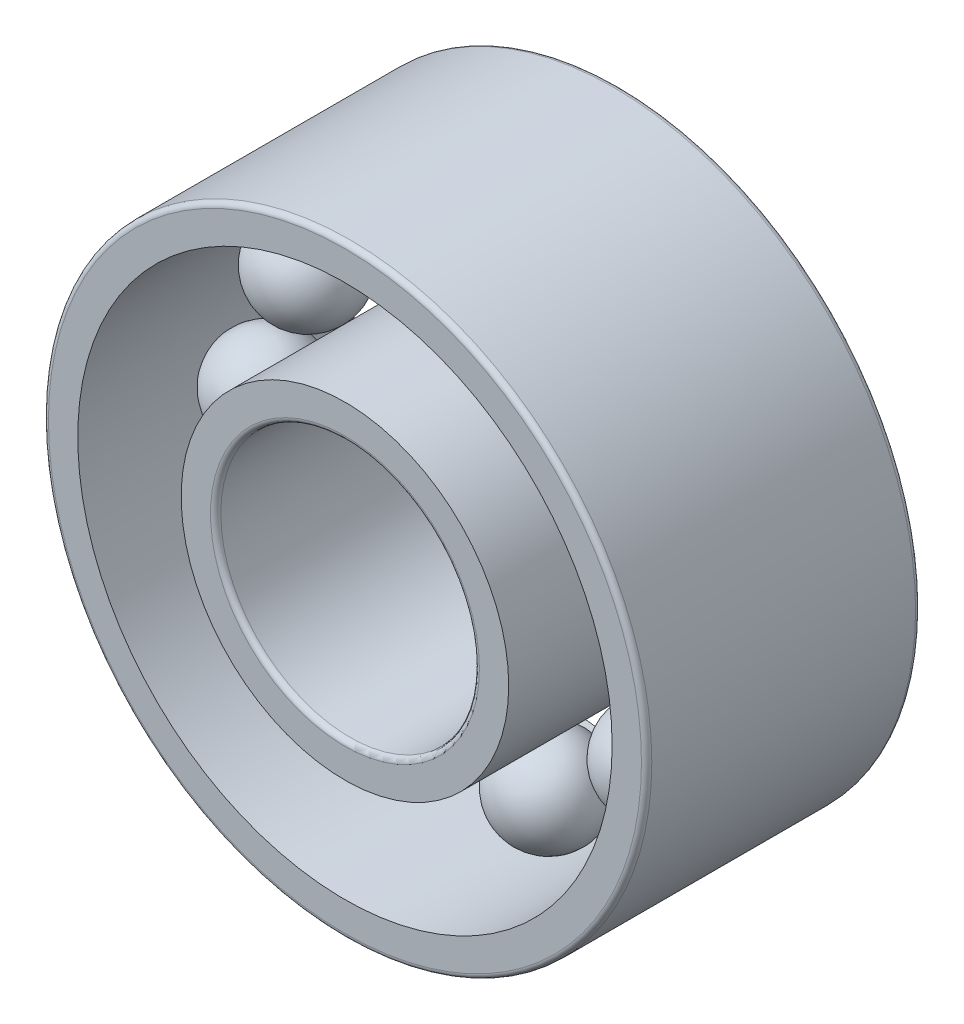
ISO-10303-21;
HEADER;
FILE_DESCRIPTION(('STEP AP214'),'2;1');
FILE_NAME('part.step','',(''),(''),'','','');
FILE_SCHEMA(('AUTOMOTIVE_DESIGN { 1 0 10303 214 1 1 1 1 }'));
ENDSEC;
DATA;
#1=APPLICATION_CONTEXT('core data for automotive mechanical design processes');
#2=APPLICATION_PROTOCOL_DEFINITION('international standard','automotive_design',2000,#1);
#3=PRODUCT_CONTEXT('',#1,'mechanical');
#4=PRODUCT('Part','Part','',(#3));
#5=PRODUCT_RELATED_PRODUCT_CATEGORY('part','',(#4));
#6=PRODUCT_DEFINITION_FORMATION('','',#4);
#7=PRODUCT_DEFINITION_CONTEXT('part definition',#1,'design');
#8=PRODUCT_DEFINITION('design','',#6,#7);
#9=PRODUCT_DEFINITION_SHAPE('','',#8);
#10=(LENGTH_UNIT() NAMED_UNIT(*) SI_UNIT(.MILLI.,.METRE.));
#11=(NAMED_UNIT(*) PLANE_ANGLE_UNIT() SI_UNIT($,.RADIAN.));
#12=(NAMED_UNIT(*) SI_UNIT($,.STERADIAN.) SOLID_ANGLE_UNIT());
#13=UNCERTAINTY_MEASURE_WITH_UNIT(LENGTH_MEASURE(1.E-05),#10,'distance_accuracy_value','');
#14=(GEOMETRIC_REPRESENTATION_CONTEXT(3) GLOBAL_UNCERTAINTY_ASSIGNED_CONTEXT((#13)) GLOBAL_UNIT_ASSIGNED_CONTEXT((#10,
#11,#12)) REPRESENTATION_CONTEXT('',''));
#15=CARTESIAN_POINT('',(0.,0.,0.));
#16=DIRECTION('',(0.,0.,1.));
#17=DIRECTION('',(1.,0.,0.));
#18=AXIS2_PLACEMENT_3D('',#15,#16,#17);
#19=CARTESIAN_POINT('',(10.1127124296868,-7.34731565365592,0.));
#20=DIRECTION('',(-0.809016994374947,0.587785252292473,0.));
#21=DIRECTION('',(0.,0.,-1.));
#22=AXIS2_PLACEMENT_3D('',#19,#20,#21);
#23=SPHERICAL_SURFACE('',#22,2.85);
#24=CARTESIAN_POINT('',(7.80701399571824,-5.67212768462237,0.));
#25=VERTEX_POINT('',#24);
#26=VERTEX_LOOP('',#25);
#27=FACE_BOUND('',#26,.T.);
#28=ADVANCED_FACE('F38',(#27),#23,.T.);
#29=CLOSED_SHELL('',(#28));
#30=MANIFOLD_SOLID_BREP('B2',#29);
#31=CARTESIAN_POINT('',(3.86271242968684,-11.8882064536894,0.));
#32=DIRECTION('',(-0.309016994374947,0.951056516295154,0.));
#33=DIRECTION('',(0.,0.,-1.));
#34=AXIS2_PLACEMENT_3D('',#31,#32,#33);
#35=SPHERICAL_SURFACE('',#34,2.85);
#36=CARTESIAN_POINT('',(2.98201399571824,-9.17769538224823,0.));
#37=VERTEX_POINT('',#36);
#38=VERTEX_LOOP('',#37);
#39=FACE_BOUND('',#38,.T.);
#40=ADVANCED_FACE('F57',(#39),#35,.T.);
#41=CLOSED_SHELL('',(#40));
#42=MANIFOLD_SOLID_BREP('B6',#41);
#43=CARTESIAN_POINT('',(-3.86271242968684,-11.8882064536894,0.));
#44=DIRECTION('',(0.309016994374948,0.951056516295154,0.));
#45=DIRECTION('',(0.,0.,-1.));
#46=AXIS2_PLACEMENT_3D('',#43,#44,#45);
#47=SPHERICAL_SURFACE('',#46,2.85);
#48=CARTESIAN_POINT('',(-2.98201399571824,-9.17769538224823,0.));
#49=VERTEX_POINT('',#48);
#50=VERTEX_LOOP('',#49);
#51=FACE_BOUND('',#50,.T.);
#52=ADVANCED_FACE('F76',(#51),#47,.T.);
#53=CLOSED_SHELL('',(#52));
#54=MANIFOLD_SOLID_BREP('B34',#53);
#55=CARTESIAN_POINT('',(-10.1127124296868,-7.34731565365591,0.));
#56=DIRECTION('',(0.809016994374948,0.587785252292473,0.));
#57=DIRECTION('',(0.,0.,-1.));
#58=AXIS2_PLACEMENT_3D('',#55,#56,#57);
#59=SPHERICAL_SURFACE('',#58,2.85);
#60=CARTESIAN_POINT('',(-7.80701399571825,-5.67212768462237,0.));
#61=VERTEX_POINT('',#60);
#62=VERTEX_LOOP('',#61);
#63=FACE_BOUND('',#62,.T.);
#64=ADVANCED_FACE('F95',(#63),#59,.T.);
#65=CLOSED_SHELL('',(#64));
#66=MANIFOLD_SOLID_BREP('B53',#65);
#67=CARTESIAN_POINT('',(-12.5,0.,0.));
#68=DIRECTION('',(1.,0.,0.));
#69=DIRECTION('',(0.,0.,-1.));
#70=AXIS2_PLACEMENT_3D('',#67,#68,#69);
#71=SPHERICAL_SURFACE('',#70,2.85);
#72=CARTESIAN_POINT('',(-9.65,0.,0.));
#73=VERTEX_POINT('',#72);
#74=VERTEX_LOOP('',#73);
#75=FACE_BOUND('',#74,.T.);
#76=ADVANCED_FACE('F114',(#75),#71,.T.);
#77=CLOSED_SHELL('',(#76));
#78=MANIFOLD_SOLID_BREP('B72',#77);
#79=CARTESIAN_POINT('',(-10.1127124296868,7.34731565365592,0.));
#80=DIRECTION('',(0.809016994374947,-0.587785252292473,0.));
#81=DIRECTION('',(0.,0.,-1.));
#82=AXIS2_PLACEMENT_3D('',#79,#80,#81);
#83=SPHERICAL_SURFACE('',#82,2.85);
#84=CARTESIAN_POINT('',(-7.80701399571824,5.67212768462237,0.));
#85=VERTEX_POINT('',#84);
#86=VERTEX_LOOP('',#85);
#87=FACE_BOUND('',#86,.T.);
#88=ADVANCED_FACE('F133',(#87),#83,.T.);
#89=CLOSED_SHELL('',(#88));
#90=MANIFOLD_SOLID_BREP('B91',#89);
#91=CARTESIAN_POINT('',(-3.86271242968684,11.8882064536894,0.));
#92=DIRECTION('',(0.309016994374947,-0.951056516295154,0.));
#93=DIRECTION('',(0.,0.,-1.));
#94=AXIS2_PLACEMENT_3D('',#91,#92,#93);
#95=SPHERICAL_SURFACE('',#94,2.85);
#96=CARTESIAN_POINT('',(-2.98201399571824,9.17769538224823,0.));
#97=VERTEX_POINT('',#96);
#98=VERTEX_LOOP('',#97);
#99=FACE_BOUND('',#98,.T.);
#100=ADVANCED_FACE('F152',(#99),#95,.T.);
#101=CLOSED_SHELL('',(#100));
#102=MANIFOLD_SOLID_BREP('B110',#101);
#103=CARTESIAN_POINT('',(3.86271242968684,11.8882064536894,0.));
#104=DIRECTION('',(-0.309016994374948,-0.951056516295154,0.));
#105=DIRECTION('',(0.,0.,-1.));
#106=AXIS2_PLACEMENT_3D('',#103,#104,#105);
#107=SPHERICAL_SURFACE('',#106,2.85);
#108=CARTESIAN_POINT('',(2.98201399571824,9.17769538224823,0.));
#109=VERTEX_POINT('',#108);
#110=VERTEX_LOOP('',#109);
#111=FACE_BOUND('',#110,.T.);
#112=ADVANCED_FACE('F171',(#111),#107,.T.);
#113=CLOSED_SHELL('',(#112));
#114=MANIFOLD_SOLID_BREP('B129',#113);
#115=CARTESIAN_POINT('',(10.1127124296868,7.34731565365591,0.));
#116=DIRECTION('',(-0.809016994374947,-0.587785252292473,0.));
#117=DIRECTION('',(0.,0.,-1.));
#118=AXIS2_PLACEMENT_3D('',#115,#116,#117);
#119=SPHERICAL_SURFACE('',#118,2.85);
#120=CARTESIAN_POINT('',(7.80701399571824,5.67212768462237,0.));
#121=VERTEX_POINT('',#120);
#122=VERTEX_LOOP('',#121);
#123=FACE_BOUND('',#122,.T.);
#124=ADVANCED_FACE('F190',(#123),#119,.T.);
#125=CLOSED_SHELL('',(#124));
#126=MANIFOLD_SOLID_BREP('B148',#125);
#127=CARTESIAN_POINT('',(12.5,0.,0.));
#128=DIRECTION('',(-1.,0.,0.));
#129=DIRECTION('',(0.,0.,-1.));
#130=AXIS2_PLACEMENT_3D('',#127,#128,#129);
#131=SPHERICAL_SURFACE('',#130,2.85);
#132=CARTESIAN_POINT('',(9.65,0.,0.));
#133=VERTEX_POINT('',#132);
#134=VERTEX_LOOP('',#133);
#135=FACE_BOUND('',#134,.T.);
#136=ADVANCED_FACE('F211',(#135),#131,.T.);
#137=CLOSED_SHELL('',(#136));
#138=MANIFOLD_SOLID_BREP('B167',#137);
#139=CARTESIAN_POINT('',(0.,0.,12.925));
#140=DIRECTION('',(0.,0.,1.));
#141=DIRECTION('',(1.,0.,0.));
#142=AXIS2_PLACEMENT_3D('',#139,#140,#141);
#143=CYLINDRICAL_SURFACE('',#142,15.5);
#144=CARTESIAN_POINT('',(0.,0.,7.95));
#145=DIRECTION('',(0.,0.,1.));
#146=DIRECTION('',(1.,0.,0.));
#147=AXIS2_PLACEMENT_3D('',#144,#145,#146);
#148=CIRCLE('',#147,15.5);
#149=CARTESIAN_POINT('',(15.5,0.,7.95));
#150=VERTEX_POINT('',#149);
#151=EDGE_CURVE('E251',#150,#150,#148,.T.);
#152=ORIENTED_EDGE('',*,*,#151,.T.);
#153=EDGE_LOOP('',(#152));
#154=FACE_BOUND('',#153,.T.);
#155=CARTESIAN_POINT('',(0.,0.,-7.95));
#156=DIRECTION('',(0.,0.,1.));
#157=DIRECTION('',(1.,0.,0.));
#158=AXIS2_PLACEMENT_3D('',#155,#156,#157);
#159=CIRCLE('',#158,15.5);
#160=CARTESIAN_POINT('',(15.5,0.,-7.95));
#161=VERTEX_POINT('',#160);
#162=EDGE_CURVE('E254',#161,#161,#159,.T.);
#163=ORIENTED_EDGE('',*,*,#162,.F.);
#164=EDGE_LOOP('',(#163));
#165=FACE_BOUND('',#164,.T.);
#166=ADVANCED_FACE('F231',(#154,#165),#143,.F.);
#167=CARTESIAN_POINT('',(15.5,0.,7.95));
#168=DIRECTION('',(0.,0.,1.));
#169=DIRECTION('',(1.,0.,0.));
#170=AXIS2_PLACEMENT_3D('',#167,#168,#169);
#171=PLANE('',#170);
#172=CARTESIAN_POINT('',(0.,0.,7.95));
#173=DIRECTION('',(0.,0.,1.));
#174=DIRECTION('',(1.,0.,0.));
#175=AXIS2_PLACEMENT_3D('',#172,#173,#174);
#176=CIRCLE('',#175,17.2);
#177=CARTESIAN_POINT('',(17.2,0.,7.95));
#178=VERTEX_POINT('',#177);
#179=EDGE_CURVE('E210',#178,#178,#176,.T.);
#180=ORIENTED_EDGE('',*,*,#179,.T.);
#181=EDGE_LOOP('',(#180));
#182=FACE_BOUND('',#181,.T.);
#183=ORIENTED_EDGE('',*,*,#151,.F.);
#184=EDGE_LOOP('',(#183));
#185=FACE_BOUND('',#184,.T.);
#186=ADVANCED_FACE('F261',(#182,#185),#171,.T.);
#187=CARTESIAN_POINT('',(0.,0.,12.925));
#188=DIRECTION('',(0.,0.,1.));
#189=DIRECTION('',(1.,0.,0.));
#190=AXIS2_PLACEMENT_3D('',#187,#188,#189);
#191=CYLINDRICAL_SURFACE('',#190,17.5);
#192=CARTESIAN_POINT('',(0.,0.,-7.65));
#193=DIRECTION('',(0.,0.,-1.));
#194=DIRECTION('',(-1.,0.,0.));
#195=AXIS2_PLACEMENT_3D('',#192,#193,#194);
#196=CIRCLE('',#195,17.5);
#197=CARTESIAN_POINT('',(-17.5,0.,-7.65));
#198=VERTEX_POINT('',#197);
#199=EDGE_CURVE('E242',#198,#198,#196,.F.);
#200=ORIENTED_EDGE('',*,*,#199,.T.);
#201=EDGE_LOOP('',(#200));
#202=FACE_BOUND('',#201,.T.);
#203=CARTESIAN_POINT('',(0.,0.,7.65));
#204=DIRECTION('',(0.,0.,1.));
#205=DIRECTION('',(1.,0.,0.));
#206=AXIS2_PLACEMENT_3D('',#203,#204,#205);
#207=CIRCLE('',#206,17.5);
#208=CARTESIAN_POINT('',(17.5,0.,7.65));
#209=VERTEX_POINT('',#208);
#210=EDGE_CURVE('E246',#209,#209,#207,.F.);
#211=ORIENTED_EDGE('',*,*,#210,.T.);
#212=EDGE_LOOP('',(#211));
#213=FACE_BOUND('',#212,.T.);
#214=ADVANCED_FACE('F267',(#202,#213),#191,.T.);
#215=CARTESIAN_POINT('',(17.5,0.,-7.95));
#216=DIRECTION('',(0.,0.,-1.));
#217=DIRECTION('',(-1.,0.,0.));
#218=AXIS2_PLACEMENT_3D('',#215,#216,#217);
#219=PLANE('',#218);
#220=CARTESIAN_POINT('',(0.,0.,-7.95));
#221=DIRECTION('',(0.,0.,-1.));
#222=DIRECTION('',(-1.,0.,0.));
#223=AXIS2_PLACEMENT_3D('',#220,#221,#222);
#224=CIRCLE('',#223,17.2);
#225=CARTESIAN_POINT('',(-17.2,0.,-7.95));
#226=VERTEX_POINT('',#225);
#227=EDGE_CURVE('E238',#226,#226,#224,.T.);
#228=ORIENTED_EDGE('',*,*,#227,.T.);
#229=EDGE_LOOP('',(#228));
#230=FACE_BOUND('',#229,.T.);
#231=ORIENTED_EDGE('',*,*,#162,.T.);
#232=EDGE_LOOP('',(#231));
#233=FACE_BOUND('',#232,.T.);
#234=ADVANCED_FACE('F258',(#230,#233),#219,.T.);
#235=CARTESIAN_POINT('',(0.,0.,-7.65));
#236=DIRECTION('',(0.,0.,-1.));
#237=DIRECTION('',(-1.,0.,0.));
#238=AXIS2_PLACEMENT_3D('',#235,#236,#237);
#239=TOROIDAL_SURFACE('',#238,17.2,0.3);
#240=ORIENTED_EDGE('',*,*,#227,.F.);
#241=EDGE_LOOP('',(#240));
#242=FACE_BOUND('',#241,.T.);
#243=ORIENTED_EDGE('',*,*,#199,.F.);
#244=EDGE_LOOP('',(#243));
#245=FACE_BOUND('',#244,.T.);
#246=ADVANCED_FACE('F270',(#242,#245),#239,.T.);
#247=CARTESIAN_POINT('',(0.,0.,7.65));
#248=DIRECTION('',(0.,0.,1.));
#249=DIRECTION('',(1.,0.,0.));
#250=AXIS2_PLACEMENT_3D('',#247,#248,#249);
#251=TOROIDAL_SURFACE('',#250,17.2,0.3);
#252=ORIENTED_EDGE('',*,*,#210,.F.);
#253=EDGE_LOOP('',(#252));
#254=FACE_BOUND('',#253,.T.);
#255=ORIENTED_EDGE('',*,*,#179,.F.);
#256=EDGE_LOOP('',(#255));
#257=FACE_BOUND('',#256,.T.);
#258=ADVANCED_FACE('F233',(#254,#257),#251,.T.);
#259=CLOSED_SHELL('',(#166,#186,#214,#234,#246,#258));
#260=MANIFOLD_SOLID_BREP('B186',#259);
#261=CARTESIAN_POINT('',(0.,0.,12.925));
#262=DIRECTION('',(0.,0.,1.));
#263=DIRECTION('',(1.,0.,0.));
#264=AXIS2_PLACEMENT_3D('',#261,#262,#263);
#265=CYLINDRICAL_SURFACE('',#264,7.5);
#266=CARTESIAN_POINT('',(0.,0.,-7.65));
#267=DIRECTION('',(0.,0.,-1.));
#268=DIRECTION('',(-1.,0.,0.));
#269=AXIS2_PLACEMENT_3D('',#266,#267,#268);
#270=CIRCLE('',#269,7.5);
#271=CARTESIAN_POINT('',(-7.5,0.,-7.65));
#272=VERTEX_POINT('',#271);
#273=EDGE_CURVE('E330',#272,#272,#270,.T.);
#274=ORIENTED_EDGE('',*,*,#273,.T.);
#275=EDGE_LOOP('',(#274));
#276=FACE_BOUND('',#275,.T.);
#277=CARTESIAN_POINT('',(0.,0.,7.65));
#278=DIRECTION('',(0.,0.,1.));
#279=DIRECTION('',(1.,0.,0.));
#280=AXIS2_PLACEMENT_3D('',#277,#278,#279);
#281=CIRCLE('',#280,7.5);
#282=CARTESIAN_POINT('',(7.5,0.,7.65));
#283=VERTEX_POINT('',#282);
#284=EDGE_CURVE('E334',#283,#283,#281,.T.);
#285=ORIENTED_EDGE('',*,*,#284,.T.);
#286=EDGE_LOOP('',(#285));
#287=FACE_BOUND('',#286,.T.);
#288=ADVANCED_FACE('F323',(#276,#287),#265,.F.);
#289=CARTESIAN_POINT('',(7.5,0.,7.95));
#290=DIRECTION('',(0.,0.,1.));
#291=DIRECTION('',(1.,0.,0.));
#292=AXIS2_PLACEMENT_3D('',#289,#290,#291);
#293=PLANE('',#292);
#294=CARTESIAN_POINT('',(0.,0.,7.95));
#295=DIRECTION('',(0.,0.,1.));
#296=DIRECTION('',(1.,0.,0.));
#297=AXIS2_PLACEMENT_3D('',#294,#295,#296);
#298=CIRCLE('',#297,7.8);
#299=CARTESIAN_POINT('',(7.8,0.,7.95));
#300=VERTEX_POINT('',#299);
#301=EDGE_CURVE('E230',#300,#300,#298,.F.);
#302=ORIENTED_EDGE('',*,*,#301,.T.);
#303=EDGE_LOOP('',(#302));
#304=FACE_BOUND('',#303,.T.);
#305=CARTESIAN_POINT('',(0.,0.,7.95));
#306=DIRECTION('',(0.,0.,1.));
#307=DIRECTION('',(1.,0.,0.));
#308=AXIS2_PLACEMENT_3D('',#305,#306,#307);
#309=CIRCLE('',#308,9.5);
#310=CARTESIAN_POINT('',(9.5,0.,7.95));
#311=VERTEX_POINT('',#310);
#312=EDGE_CURVE('E343',#311,#311,#309,.T.);
#313=ORIENTED_EDGE('',*,*,#312,.T.);
#314=EDGE_LOOP('',(#313));
#315=FACE_BOUND('',#314,.T.);
#316=ADVANCED_FACE('F363',(#304,#315),#293,.T.);
#317=CARTESIAN_POINT('',(0.,0.,12.925));
#318=DIRECTION('',(0.,0.,1.));
#319=DIRECTION('',(1.,0.,0.));
#320=AXIS2_PLACEMENT_3D('',#317,#318,#319);
#321=CYLINDRICAL_SURFACE('',#320,9.5);
#322=CARTESIAN_POINT('',(0.,0.,-7.95));
#323=DIRECTION('',(0.,0.,1.));
#324=DIRECTION('',(1.,0.,0.));
#325=AXIS2_PLACEMENT_3D('',#322,#323,#324);
#326=CIRCLE('',#325,9.5);
#327=CARTESIAN_POINT('',(9.5,0.,-7.95));
#328=VERTEX_POINT('',#327);
#329=EDGE_CURVE('E346',#328,#328,#326,.T.);
#330=ORIENTED_EDGE('',*,*,#329,.T.);
#331=EDGE_LOOP('',(#330));
#332=FACE_BOUND('',#331,.T.);
#333=ORIENTED_EDGE('',*,*,#312,.F.);
#334=EDGE_LOOP('',(#333));
#335=FACE_BOUND('',#334,.T.);
#336=ADVANCED_FACE('F350',(#332,#335),#321,.T.);
#337=CARTESIAN_POINT('',(9.5,0.,-7.95));
#338=DIRECTION('',(0.,0.,-1.));
#339=DIRECTION('',(-1.,0.,0.));
#340=AXIS2_PLACEMENT_3D('',#337,#338,#339);
#341=PLANE('',#340);
#342=CARTESIAN_POINT('',(0.,0.,-7.95));
#343=DIRECTION('',(0.,0.,-1.));
#344=DIRECTION('',(-1.,0.,0.));
#345=AXIS2_PLACEMENT_3D('',#342,#343,#344);
#346=CIRCLE('',#345,7.8);
#347=CARTESIAN_POINT('',(-7.8,0.,-7.95));
#348=VERTEX_POINT('',#347);
#349=EDGE_CURVE('E338',#348,#348,#346,.F.);
#350=ORIENTED_EDGE('',*,*,#349,.T.);
#351=EDGE_LOOP('',(#350));
#352=FACE_BOUND('',#351,.T.);
#353=ORIENTED_EDGE('',*,*,#329,.F.);
#354=EDGE_LOOP('',(#353));
#355=FACE_BOUND('',#354,.T.);
#356=ADVANCED_FACE('F353',(#352,#355),#341,.T.);
#357=CARTESIAN_POINT('',(0.,0.,-7.65));
#358=DIRECTION('',(0.,0.,-1.));
#359=DIRECTION('',(-1.,0.,0.));
#360=AXIS2_PLACEMENT_3D('',#357,#358,#359);
#361=TOROIDAL_SURFACE('',#360,7.8,0.3);
#362=ORIENTED_EDGE('',*,*,#273,.F.);
#363=EDGE_LOOP('',(#362));
#364=FACE_BOUND('',#363,.T.);
#365=ORIENTED_EDGE('',*,*,#349,.F.);
#366=EDGE_LOOP('',(#365));
#367=FACE_BOUND('',#366,.T.);
#368=ADVANCED_FACE('F355',(#364,#367),#361,.T.);
#369=CARTESIAN_POINT('',(0.,0.,7.65));
#370=DIRECTION('',(0.,0.,1.));
#371=DIRECTION('',(1.,0.,0.));
#372=AXIS2_PLACEMENT_3D('',#369,#370,#371);
#373=TOROIDAL_SURFACE('',#372,7.8,0.3);
#374=ORIENTED_EDGE('',*,*,#301,.F.);
#375=EDGE_LOOP('',(#374));
#376=FACE_BOUND('',#375,.T.);
#377=ORIENTED_EDGE('',*,*,#284,.F.);
#378=EDGE_LOOP('',(#377));
#379=FACE_BOUND('',#378,.T.);
#380=ADVANCED_FACE('F325',(#376,#379),#373,.T.);
#381=CLOSED_SHELL('',(#288,#316,#336,#356,#368,#380));
#382=MANIFOLD_SOLID_BREP('B205',#381);
#383=ADVANCED_BREP_SHAPE_REPRESENTATION('',(#18,#30,#42,#54,#66,#78,#90,#102,#114,#126,#138,
#260,#382),#14);
#384=SHAPE_DEFINITION_REPRESENTATION(#9,#383);
ENDSEC;
END-ISO-10303-21;
